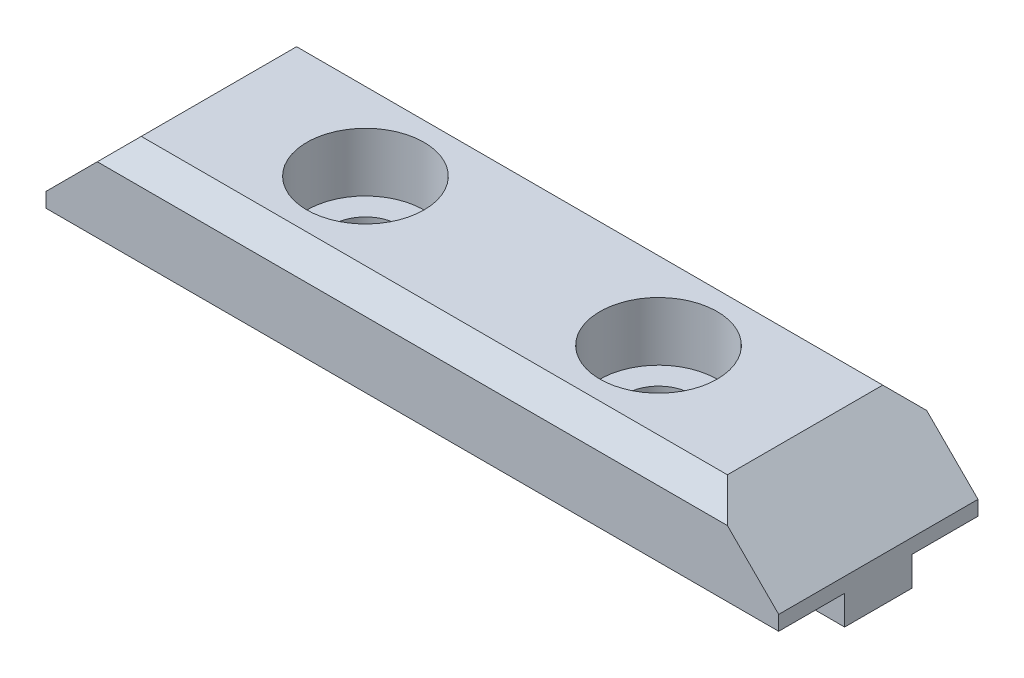
ISO-10303-21;
HEADER;
FILE_DESCRIPTION(('STEP AP214'),'2;1');
FILE_NAME('part.step','',(''),(''),'','','');
FILE_SCHEMA(('AUTOMOTIVE_DESIGN { 1 0 10303 214 1 1 1 1 }'));
ENDSEC;
DATA;
#1=APPLICATION_CONTEXT('core data for automotive mechanical design processes');
#2=APPLICATION_PROTOCOL_DEFINITION('international standard','automotive_design',2000,#1);
#3=PRODUCT_CONTEXT('',#1,'mechanical');
#4=PRODUCT('Part','Part','',(#3));
#5=PRODUCT_RELATED_PRODUCT_CATEGORY('part','',(#4));
#6=PRODUCT_DEFINITION_FORMATION('','',#4);
#7=PRODUCT_DEFINITION_CONTEXT('part definition',#1,'design');
#8=PRODUCT_DEFINITION('design','',#6,#7);
#9=PRODUCT_DEFINITION_SHAPE('','',#8);
#10=(LENGTH_UNIT() NAMED_UNIT(*) SI_UNIT(.MILLI.,.METRE.));
#11=(NAMED_UNIT(*) PLANE_ANGLE_UNIT() SI_UNIT($,.RADIAN.));
#12=(NAMED_UNIT(*) SI_UNIT($,.STERADIAN.) SOLID_ANGLE_UNIT());
#13=UNCERTAINTY_MEASURE_WITH_UNIT(LENGTH_MEASURE(1.E-05),#10,'distance_accuracy_value','');
#14=(GEOMETRIC_REPRESENTATION_CONTEXT(3) GLOBAL_UNCERTAINTY_ASSIGNED_CONTEXT((#13)) GLOBAL_UNIT_ASSIGNED_CONTEXT((#10,
#11,#12)) REPRESENTATION_CONTEXT('',''));
#15=CARTESIAN_POINT('',(0.,0.,0.));
#16=DIRECTION('',(0.,0.,1.));
#17=DIRECTION('',(1.,0.,0.));
#18=AXIS2_PLACEMENT_3D('',#15,#16,#17);
#19=CARTESIAN_POINT('',(26.5,8.,6.8));
#20=DIRECTION('',(-1.,0.,0.));
#21=DIRECTION('',(0.,0.,1.));
#22=AXIS2_PLACEMENT_3D('',#19,#20,#21);
#23=PLANE('',#22);
#24=DIRECTION('',(0.,0.,1.));
#25=VECTOR('',#24,1.);
#26=CARTESIAN_POINT('',(26.5,7.,10.2));
#27=LINE('',#26,#25);
#28=CARTESIAN_POINT('',(26.5,7.,0.));
#29=VERTEX_POINT('',#28);
#30=CARTESIAN_POINT('',(26.5,7.,13.6));
#31=VERTEX_POINT('',#30);
#32=EDGE_CURVE('E170',#29,#31,#27,.T.);
#33=ORIENTED_EDGE('',*,*,#32,.F.);
#34=DIRECTION('',(0.,-1.,0.));
#35=VECTOR('',#34,1.);
#36=CARTESIAN_POINT('',(26.5,12.,0.));
#37=LINE('',#36,#35);
#38=CARTESIAN_POINT('',(26.5,6.,0.));
#39=VERTEX_POINT('',#38);
#40=EDGE_CURVE('E158',#29,#39,#37,.T.);
#41=ORIENTED_EDGE('',*,*,#40,.T.);
#42=DIRECTION('',(0.,0.,1.));
#43=VECTOR('',#42,1.);
#44=CARTESIAN_POINT('',(26.5,6.,0.));
#45=LINE('',#44,#43);
#46=CARTESIAN_POINT('',(26.5,6.,4.5));
#47=VERTEX_POINT('',#46);
#48=EDGE_CURVE('E105',#39,#47,#45,.T.);
#49=ORIENTED_EDGE('',*,*,#48,.T.);
#50=DIRECTION('',(0.,-1.,0.));
#51=VECTOR('',#50,1.);
#52=CARTESIAN_POINT('',(26.5,6.,4.5));
#53=LINE('',#52,#51);
#54=CARTESIAN_POINT('',(26.5,4.,4.5));
#55=VERTEX_POINT('',#54);
#56=EDGE_CURVE('E11',#47,#55,#53,.T.);
#57=ORIENTED_EDGE('',*,*,#56,.T.);
#58=DIRECTION('',(0.,0.,1.));
#59=VECTOR('',#58,1.);
#60=CARTESIAN_POINT('',(26.5,4.,4.5));
#61=LINE('',#60,#59);
#62=CARTESIAN_POINT('',(26.5,4.,9.1));
#63=VERTEX_POINT('',#62);
#64=EDGE_CURVE('E57',#55,#63,#61,.T.);
#65=ORIENTED_EDGE('',*,*,#64,.T.);
#66=DIRECTION('',(0.,1.,0.));
#67=VECTOR('',#66,1.);
#68=CARTESIAN_POINT('',(26.5,4.,9.1));
#69=LINE('',#68,#67);
#70=CARTESIAN_POINT('',(26.5,6.,9.1));
#71=VERTEX_POINT('',#70);
#72=EDGE_CURVE('E62',#63,#71,#69,.T.);
#73=ORIENTED_EDGE('',*,*,#72,.T.);
#74=DIRECTION('',(0.,0.,1.));
#75=VECTOR('',#74,1.);
#76=CARTESIAN_POINT('',(26.5,6.,9.1));
#77=LINE('',#76,#75);
#78=CARTESIAN_POINT('',(26.5,6.,13.6));
#79=VERTEX_POINT('',#78);
#80=EDGE_CURVE('E110',#71,#79,#77,.T.);
#81=ORIENTED_EDGE('',*,*,#80,.T.);
#82=DIRECTION('',(0.,1.,0.));
#83=VECTOR('',#82,1.);
#84=CARTESIAN_POINT('',(26.5,6.,13.6));
#85=LINE('',#84,#83);
#86=EDGE_CURVE('E129',#79,#31,#85,.T.);
#87=ORIENTED_EDGE('',*,*,#86,.T.);
#88=EDGE_LOOP('',(#33,#41,#49,#57,#65,#73,#81,#87));
#89=FACE_BOUND('',#88,.T.);
#90=ADVANCED_FACE('F16',(#89),#23,.T.);
#91=CARTESIAN_POINT('',(76.5,8.,6.8));
#92=DIRECTION('',(1.,0.,0.));
#93=DIRECTION('',(0.,-1.,0.));
#94=AXIS2_PLACEMENT_3D('',#91,#92,#93);
#95=PLANE('',#94);
#96=DIRECTION('',(0.,0.,-1.));
#97=VECTOR('',#96,1.);
#98=CARTESIAN_POINT('',(76.5,7.,10.2));
#99=LINE('',#98,#97);
#100=CARTESIAN_POINT('',(76.5,7.,13.6));
#101=VERTEX_POINT('',#100);
#102=CARTESIAN_POINT('',(76.5,7.,0.));
#103=VERTEX_POINT('',#102);
#104=EDGE_CURVE('E153',#101,#103,#99,.T.);
#105=ORIENTED_EDGE('',*,*,#104,.F.);
#106=DIRECTION('',(0.,1.,0.));
#107=VECTOR('',#106,1.);
#108=CARTESIAN_POINT('',(76.5,6.,13.6));
#109=LINE('',#108,#107);
#110=CARTESIAN_POINT('',(76.5,6.,13.6));
#111=VERTEX_POINT('',#110);
#112=EDGE_CURVE('E196',#111,#101,#109,.T.);
#113=ORIENTED_EDGE('',*,*,#112,.F.);
#114=DIRECTION('',(0.,0.,1.));
#115=VECTOR('',#114,1.);
#116=CARTESIAN_POINT('',(76.5,6.,9.1));
#117=LINE('',#116,#115);
#118=CARTESIAN_POINT('',(76.5,6.,9.1));
#119=VERTEX_POINT('',#118);
#120=EDGE_CURVE('E107',#119,#111,#117,.T.);
#121=ORIENTED_EDGE('',*,*,#120,.F.);
#122=DIRECTION('',(0.,1.,0.));
#123=VECTOR('',#122,1.);
#124=CARTESIAN_POINT('',(76.5,4.,9.1));
#125=LINE('',#124,#123);
#126=CARTESIAN_POINT('',(76.5,4.,9.1));
#127=VERTEX_POINT('',#126);
#128=EDGE_CURVE('E83',#127,#119,#125,.T.);
#129=ORIENTED_EDGE('',*,*,#128,.F.);
#130=DIRECTION('',(0.,0.,1.));
#131=VECTOR('',#130,1.);
#132=CARTESIAN_POINT('',(76.5,4.,4.5));
#133=LINE('',#132,#131);
#134=CARTESIAN_POINT('',(76.5,4.,4.5));
#135=VERTEX_POINT('',#134);
#136=EDGE_CURVE('E68',#135,#127,#133,.T.);
#137=ORIENTED_EDGE('',*,*,#136,.F.);
#138=DIRECTION('',(0.,-1.,0.));
#139=VECTOR('',#138,1.);
#140=CARTESIAN_POINT('',(76.5,6.,4.5));
#141=LINE('',#140,#139);
#142=CARTESIAN_POINT('',(76.5,6.,4.5));
#143=VERTEX_POINT('',#142);
#144=EDGE_CURVE('E25',#143,#135,#141,.T.);
#145=ORIENTED_EDGE('',*,*,#144,.F.);
#146=DIRECTION('',(0.,0.,1.));
#147=VECTOR('',#146,1.);
#148=CARTESIAN_POINT('',(76.5,6.,0.));
#149=LINE('',#148,#147);
#150=CARTESIAN_POINT('',(76.5,6.,0.));
#151=VERTEX_POINT('',#150);
#152=EDGE_CURVE('E190',#151,#143,#149,.T.);
#153=ORIENTED_EDGE('',*,*,#152,.F.);
#154=DIRECTION('',(0.,-1.,0.));
#155=VECTOR('',#154,1.);
#156=CARTESIAN_POINT('',(76.5,12.,0.));
#157=LINE('',#156,#155);
#158=EDGE_CURVE('E159',#103,#151,#157,.T.);
#159=ORIENTED_EDGE('',*,*,#158,.F.);
#160=EDGE_LOOP('',(#105,#113,#121,#129,#137,#145,#153,#159));
#161=FACE_BOUND('',#160,.T.);
#162=ADVANCED_FACE('F261',(#161),#95,.T.);
#163=CARTESIAN_POINT('',(76.5,6.,4.5));
#164=DIRECTION('',(0.,0.,-1.));
#165=DIRECTION('',(0.,-1.,0.));
#166=AXIS2_PLACEMENT_3D('',#163,#164,#165);
#167=PLANE('',#166);
#168=ORIENTED_EDGE('',*,*,#144,.T.);
#169=DIRECTION('',(-1.,0.,0.));
#170=VECTOR('',#169,1.);
#171=CARTESIAN_POINT('',(76.5,4.,4.5));
#172=LINE('',#171,#170);
#173=EDGE_CURVE('E67',#135,#55,#172,.T.);
#174=ORIENTED_EDGE('',*,*,#173,.T.);
#175=ORIENTED_EDGE('',*,*,#56,.F.);
#176=DIRECTION('',(-1.,0.,0.));
#177=VECTOR('',#176,1.);
#178=CARTESIAN_POINT('',(76.5,6.,4.5));
#179=LINE('',#178,#177);
#180=EDGE_CURVE('E186',#143,#47,#179,.T.);
#181=ORIENTED_EDGE('',*,*,#180,.F.);
#182=EDGE_LOOP('',(#168,#174,#175,#181));
#183=FACE_BOUND('',#182,.T.);
#184=ADVANCED_FACE('F325',(#183),#167,.T.);
#185=CARTESIAN_POINT('',(76.5,4.,4.5));
#186=DIRECTION('',(0.,-1.,0.));
#187=DIRECTION('',(-1.,0.,0.));
#188=AXIS2_PLACEMENT_3D('',#185,#186,#187);
#189=PLANE('',#188);
#190=CARTESIAN_POINT('',(41.5,4.,6.8));
#191=DIRECTION('',(0.,1.,0.));
#192=DIRECTION('',(-1.,0.,0.));
#193=AXIS2_PLACEMENT_3D('',#190,#191,#192);
#194=CIRCLE('',#193,2.25);
#195=CARTESIAN_POINT('',(43.75,4.,6.8));
#196=VERTEX_POINT('',#195);
#197=EDGE_CURVE('E147',#196,#196,#194,.T.);
#198=ORIENTED_EDGE('',*,*,#197,.T.);
#199=EDGE_LOOP('',(#198));
#200=FACE_BOUND('',#199,.T.);
#201=CARTESIAN_POINT('',(61.5,4.,6.8));
#202=DIRECTION('',(0.,1.,0.));
#203=DIRECTION('',(-1.,0.,0.));
#204=AXIS2_PLACEMENT_3D('',#201,#202,#203);
#205=CIRCLE('',#204,2.25);
#206=CARTESIAN_POINT('',(63.75,4.,6.8));
#207=VERTEX_POINT('',#206);
#208=EDGE_CURVE('E220',#207,#207,#205,.T.);
#209=ORIENTED_EDGE('',*,*,#208,.T.);
#210=EDGE_LOOP('',(#209));
#211=FACE_BOUND('',#210,.T.);
#212=ORIENTED_EDGE('',*,*,#136,.T.);
#213=DIRECTION('',(-1.,0.,0.));
#214=VECTOR('',#213,1.);
#215=CARTESIAN_POINT('',(76.5,4.,9.1));
#216=LINE('',#215,#214);
#217=EDGE_CURVE('E71',#127,#63,#216,.T.);
#218=ORIENTED_EDGE('',*,*,#217,.T.);
#219=ORIENTED_EDGE('',*,*,#64,.F.);
#220=ORIENTED_EDGE('',*,*,#173,.F.);
#221=EDGE_LOOP('',(#212,#218,#219,#220));
#222=FACE_BOUND('',#221,.T.);
#223=ADVANCED_FACE('F72',(#200,#211,#222),#189,.T.);
#224=CARTESIAN_POINT('',(76.5,4.,9.1));
#225=DIRECTION('',(0.,0.,1.));
#226=DIRECTION('',(1.,0.,0.));
#227=AXIS2_PLACEMENT_3D('',#224,#225,#226);
#228=PLANE('',#227);
#229=ORIENTED_EDGE('',*,*,#128,.T.);
#230=DIRECTION('',(-1.,0.,0.));
#231=VECTOR('',#230,1.);
#232=CARTESIAN_POINT('',(76.5,6.,9.1));
#233=LINE('',#232,#231);
#234=EDGE_CURVE('E80',#119,#71,#233,.T.);
#235=ORIENTED_EDGE('',*,*,#234,.T.);
#236=ORIENTED_EDGE('',*,*,#72,.F.);
#237=ORIENTED_EDGE('',*,*,#217,.F.);
#238=EDGE_LOOP('',(#229,#235,#236,#237));
#239=FACE_BOUND('',#238,.T.);
#240=ADVANCED_FACE('F78',(#239),#228,.T.);
#241=CARTESIAN_POINT('',(76.5,6.,9.1));
#242=DIRECTION('',(0.,-1.,0.));
#243=DIRECTION('',(-1.,0.,0.));
#244=AXIS2_PLACEMENT_3D('',#241,#242,#243);
#245=PLANE('',#244);
#246=ORIENTED_EDGE('',*,*,#120,.T.);
#247=DIRECTION('',(-1.,0.,0.));
#248=VECTOR('',#247,1.);
#249=CARTESIAN_POINT('',(76.5,6.,13.6));
#250=LINE('',#249,#248);
#251=EDGE_CURVE('E138',#111,#79,#250,.T.);
#252=ORIENTED_EDGE('',*,*,#251,.T.);
#253=ORIENTED_EDGE('',*,*,#80,.F.);
#254=ORIENTED_EDGE('',*,*,#234,.F.);
#255=EDGE_LOOP('',(#246,#252,#253,#254));
#256=FACE_BOUND('',#255,.T.);
#257=ADVANCED_FACE('F316',(#256),#245,.T.);
#258=CARTESIAN_POINT('',(76.5,6.,0.));
#259=DIRECTION('',(0.,-1.,0.));
#260=DIRECTION('',(-1.,0.,0.));
#261=AXIS2_PLACEMENT_3D('',#258,#259,#260);
#262=PLANE('',#261);
#263=ORIENTED_EDGE('',*,*,#152,.T.);
#264=ORIENTED_EDGE('',*,*,#180,.T.);
#265=ORIENTED_EDGE('',*,*,#48,.F.);
#266=DIRECTION('',(-1.,0.,0.));
#267=VECTOR('',#266,1.);
#268=CARTESIAN_POINT('',(76.5,6.,0.));
#269=LINE('',#268,#267);
#270=EDGE_CURVE('E163',#151,#39,#269,.T.);
#271=ORIENTED_EDGE('',*,*,#270,.F.);
#272=EDGE_LOOP('',(#263,#264,#265,#271));
#273=FACE_BOUND('',#272,.T.);
#274=ADVANCED_FACE('F253',(#273),#262,.T.);
#275=CARTESIAN_POINT('',(41.5,8.,6.8));
#276=DIRECTION('',(0.,1.,0.));
#277=DIRECTION('',(1.,0.,0.));
#278=AXIS2_PLACEMENT_3D('',#275,#276,#277);
#279=PLANE('',#278);
#280=CARTESIAN_POINT('',(41.5,8.,6.8));
#281=DIRECTION('',(0.,-1.,0.));
#282=DIRECTION('',(-1.,0.,0.));
#283=AXIS2_PLACEMENT_3D('',#280,#281,#282);
#284=CIRCLE('',#283,2.25);
#285=CARTESIAN_POINT('',(43.75,8.,6.8));
#286=VERTEX_POINT('',#285);
#287=EDGE_CURVE('E148',#286,#286,#284,.T.);
#288=ORIENTED_EDGE('',*,*,#287,.T.);
#289=EDGE_LOOP('',(#288));
#290=FACE_BOUND('',#289,.T.);
#291=CARTESIAN_POINT('',(41.5,8.,6.8));
#292=DIRECTION('',(0.,-1.,0.));
#293=DIRECTION('',(-1.,0.,0.));
#294=AXIS2_PLACEMENT_3D('',#291,#292,#293);
#295=CIRCLE('',#294,4.);
#296=CARTESIAN_POINT('',(45.5,8.,6.8));
#297=VERTEX_POINT('',#296);
#298=EDGE_CURVE('E242',#297,#297,#295,.T.);
#299=ORIENTED_EDGE('',*,*,#298,.F.);
#300=EDGE_LOOP('',(#299));
#301=FACE_BOUND('',#300,.T.);
#302=ADVANCED_FACE('F304',(#290,#301),#279,.T.);
#303=CARTESIAN_POINT('',(41.5,12.,6.8));
#304=DIRECTION('',(0.,-1.,0.));
#305=DIRECTION('',(-1.,0.,0.));
#306=AXIS2_PLACEMENT_3D('',#303,#304,#305);
#307=CYLINDRICAL_SURFACE('',#306,4.);
#308=CARTESIAN_POINT('',(41.5,12.,6.8));
#309=DIRECTION('',(0.,-1.,0.));
#310=DIRECTION('',(-1.,0.,0.));
#311=AXIS2_PLACEMENT_3D('',#308,#309,#310);
#312=CIRCLE('',#311,4.);
#313=CARTESIAN_POINT('',(45.5,12.,6.8));
#314=VERTEX_POINT('',#313);
#315=EDGE_CURVE('E176',#314,#314,#312,.T.);
#316=ORIENTED_EDGE('',*,*,#315,.F.);
#317=DIRECTION('',(0.,-1.,0.));
#318=VECTOR('',#317,1.);
#319=CARTESIAN_POINT('',(45.5,12.,6.8));
#320=LINE('',#319,#318);
#321=EDGE_CURVE('E235',#314,#297,#320,.T.);
#322=ORIENTED_EDGE('',*,*,#321,.T.);
#323=ORIENTED_EDGE('',*,*,#298,.T.);
#324=ORIENTED_EDGE('',*,*,#321,.F.);
#325=EDGE_LOOP('',(#316,#322,#323,#324));
#326=FACE_BOUND('',#325,.T.);
#327=ADVANCED_FACE('F300',(#326),#307,.F.);
#328=CARTESIAN_POINT('',(61.5,8.,6.8));
#329=DIRECTION('',(0.,1.,0.));
#330=DIRECTION('',(1.,0.,0.));
#331=AXIS2_PLACEMENT_3D('',#328,#329,#330);
#332=PLANE('',#331);
#333=CARTESIAN_POINT('',(61.5,8.,6.8));
#334=DIRECTION('',(0.,-1.,0.));
#335=DIRECTION('',(-1.,0.,0.));
#336=AXIS2_PLACEMENT_3D('',#333,#334,#335);
#337=CIRCLE('',#336,2.25);
#338=CARTESIAN_POINT('',(63.75,8.,6.8));
#339=VERTEX_POINT('',#338);
#340=EDGE_CURVE('E157',#339,#339,#337,.T.);
#341=ORIENTED_EDGE('',*,*,#340,.T.);
#342=EDGE_LOOP('',(#341));
#343=FACE_BOUND('',#342,.T.);
#344=CARTESIAN_POINT('',(61.5,8.,6.8));
#345=DIRECTION('',(0.,-1.,0.));
#346=DIRECTION('',(-1.,0.,0.));
#347=AXIS2_PLACEMENT_3D('',#344,#345,#346);
#348=CIRCLE('',#347,4.);
#349=CARTESIAN_POINT('',(65.5,8.,6.8));
#350=VERTEX_POINT('',#349);
#351=EDGE_CURVE('E231',#350,#350,#348,.T.);
#352=ORIENTED_EDGE('',*,*,#351,.F.);
#353=EDGE_LOOP('',(#352));
#354=FACE_BOUND('',#353,.T.);
#355=ADVANCED_FACE('F314',(#343,#354),#332,.T.);
#356=CARTESIAN_POINT('',(61.5,12.,6.8));
#357=DIRECTION('',(0.,-1.,0.));
#358=DIRECTION('',(-1.,0.,0.));
#359=AXIS2_PLACEMENT_3D('',#356,#357,#358);
#360=CYLINDRICAL_SURFACE('',#359,4.);
#361=CARTESIAN_POINT('',(61.5,12.,6.8));
#362=DIRECTION('',(0.,-1.,0.));
#363=DIRECTION('',(-1.,0.,0.));
#364=AXIS2_PLACEMENT_3D('',#361,#362,#363);
#365=CIRCLE('',#364,4.);
#366=CARTESIAN_POINT('',(65.5,12.,6.8));
#367=VERTEX_POINT('',#366);
#368=EDGE_CURVE('E171',#367,#367,#365,.T.);
#369=ORIENTED_EDGE('',*,*,#368,.F.);
#370=DIRECTION('',(0.,-1.,0.));
#371=VECTOR('',#370,1.);
#372=CARTESIAN_POINT('',(65.5,12.,6.8));
#373=LINE('',#372,#371);
#374=EDGE_CURVE('E230',#367,#350,#373,.T.);
#375=ORIENTED_EDGE('',*,*,#374,.T.);
#376=ORIENTED_EDGE('',*,*,#351,.T.);
#377=ORIENTED_EDGE('',*,*,#374,.F.);
#378=EDGE_LOOP('',(#369,#375,#376,#377));
#379=FACE_BOUND('',#378,.T.);
#380=ADVANCED_FACE('F335',(#379),#360,.F.);
#381=CARTESIAN_POINT('',(41.5,8.,6.8));
#382=DIRECTION('',(0.,-1.,0.));
#383=DIRECTION('',(-1.,0.,0.));
#384=AXIS2_PLACEMENT_3D('',#381,#382,#383);
#385=CYLINDRICAL_SURFACE('',#384,2.25);
#386=ORIENTED_EDGE('',*,*,#287,.F.);
#387=DIRECTION('',(0.,-1.,0.));
#388=VECTOR('',#387,1.);
#389=CARTESIAN_POINT('',(43.75,8.,6.8));
#390=LINE('',#389,#388);
#391=EDGE_CURVE('E143',#286,#196,#390,.T.);
#392=ORIENTED_EDGE('',*,*,#391,.T.);
#393=ORIENTED_EDGE('',*,*,#197,.F.);
#394=ORIENTED_EDGE('',*,*,#391,.F.);
#395=EDGE_LOOP('',(#386,#392,#393,#394));
#396=FACE_BOUND('',#395,.T.);
#397=ADVANCED_FACE('F337',(#396),#385,.F.);
#398=CARTESIAN_POINT('',(61.5,8.,6.8));
#399=DIRECTION('',(0.,-1.,0.));
#400=DIRECTION('',(-1.,0.,0.));
#401=AXIS2_PLACEMENT_3D('',#398,#399,#400);
#402=CYLINDRICAL_SURFACE('',#401,2.25);
#403=ORIENTED_EDGE('',*,*,#340,.F.);
#404=DIRECTION('',(0.,-1.,0.));
#405=VECTOR('',#404,1.);
#406=CARTESIAN_POINT('',(63.75,8.,6.8));
#407=LINE('',#406,#405);
#408=EDGE_CURVE('E216',#339,#207,#407,.T.);
#409=ORIENTED_EDGE('',*,*,#408,.T.);
#410=ORIENTED_EDGE('',*,*,#208,.F.);
#411=ORIENTED_EDGE('',*,*,#408,.F.);
#412=EDGE_LOOP('',(#403,#409,#410,#411));
#413=FACE_BOUND('',#412,.T.);
#414=ADVANCED_FACE('F342',(#413),#402,.F.);
#415=CARTESIAN_POINT('',(74.,9.5,10.2));
#416=DIRECTION('',(0.707106781186548,0.707106781186547,0.));
#417=DIRECTION('',(0.,0.,-1.));
#418=AXIS2_PLACEMENT_3D('',#415,#416,#417);
#419=PLANE('',#418);
#420=DIRECTION('',(0.577350269189626,-0.577350269189626,-0.577350269189626));
#421=VECTOR('',#420,1.);
#422=CARTESIAN_POINT('',(71.9666666666667,11.5333333333333,1.03333333333333));
#423=LINE('',#422,#421);
#424=CARTESIAN_POINT('',(71.5,12.,1.5));
#425=VERTEX_POINT('',#424);
#426=CARTESIAN_POINT('',(73.,10.5,0.));
#427=VERTEX_POINT('',#426);
#428=EDGE_CURVE('E123',#425,#427,#423,.T.);
#429=ORIENTED_EDGE('',*,*,#428,.F.);
#430=DIRECTION('',(0.,0.,1.));
#431=VECTOR('',#430,1.);
#432=CARTESIAN_POINT('',(71.5,12.,10.2));
#433=LINE('',#432,#431);
#434=CARTESIAN_POINT('',(71.5,12.,12.1));
#435=VERTEX_POINT('',#434);
#436=EDGE_CURVE('E152',#425,#435,#433,.T.);
#437=ORIENTED_EDGE('',*,*,#436,.T.);
#438=DIRECTION('',(-0.577350269189626,0.577350269189626,-0.577350269189626));
#439=VECTOR('',#438,1.);
#440=CARTESIAN_POINT('',(73.1,10.4,13.7));
#441=LINE('',#440,#439);
#442=CARTESIAN_POINT('',(73.,10.5,13.6));
#443=VERTEX_POINT('',#442);
#444=EDGE_CURVE('E125',#443,#435,#441,.T.);
#445=ORIENTED_EDGE('',*,*,#444,.F.);
#446=DIRECTION('',(0.707106781186547,-0.707106781186548,0.));
#447=VECTOR('',#446,1.);
#448=CARTESIAN_POINT('',(75.5,8.,13.6));
#449=LINE('',#448,#447);
#450=EDGE_CURVE('E200',#443,#101,#449,.T.);
#451=ORIENTED_EDGE('',*,*,#450,.T.);
#452=ORIENTED_EDGE('',*,*,#104,.T.);
#453=DIRECTION('',(-0.707106781186547,0.707106781186548,0.));
#454=VECTOR('',#453,1.);
#455=CARTESIAN_POINT('',(74.,9.5,0.));
#456=LINE('',#455,#454);
#457=EDGE_CURVE('E164',#103,#427,#456,.T.);
#458=ORIENTED_EDGE('',*,*,#457,.T.);
#459=EDGE_LOOP('',(#429,#437,#445,#451,#452,#458));
#460=FACE_BOUND('',#459,.T.);
#461=ADVANCED_FACE('F349',(#460),#419,.T.);
#462=CARTESIAN_POINT('',(76.5,12.,0.));
#463=DIRECTION('',(0.,0.,-1.));
#464=DIRECTION('',(0.,-1.,0.));
#465=AXIS2_PLACEMENT_3D('',#462,#463,#464);
#466=PLANE('',#465);
#467=DIRECTION('',(-1.,0.,0.));
#468=VECTOR('',#467,1.);
#469=CARTESIAN_POINT('',(76.5,10.5,0.));
#470=LINE('',#469,#468);
#471=CARTESIAN_POINT('',(30.,10.5,0.));
#472=VERTEX_POINT('',#471);
#473=EDGE_CURVE('E131',#427,#472,#470,.T.);
#474=ORIENTED_EDGE('',*,*,#473,.F.);
#475=ORIENTED_EDGE('',*,*,#457,.F.);
#476=ORIENTED_EDGE('',*,*,#158,.T.);
#477=ORIENTED_EDGE('',*,*,#270,.T.);
#478=ORIENTED_EDGE('',*,*,#40,.F.);
#479=DIRECTION('',(-0.707106781186548,-0.707106781186547,0.));
#480=VECTOR('',#479,1.);
#481=CARTESIAN_POINT('',(41.5,22.,0.));
#482=LINE('',#481,#480);
#483=EDGE_CURVE('E175',#472,#29,#482,.T.);
#484=ORIENTED_EDGE('',*,*,#483,.F.);
#485=EDGE_LOOP('',(#474,#475,#476,#477,#478,#484));
#486=FACE_BOUND('',#485,.T.);
#487=ADVANCED_FACE('F351',(#486),#466,.T.);
#488=CARTESIAN_POINT('',(76.5,6.,13.6));
#489=DIRECTION('',(0.,0.,1.));
#490=DIRECTION('',(1.,0.,0.));
#491=AXIS2_PLACEMENT_3D('',#488,#489,#490);
#492=PLANE('',#491);
#493=DIRECTION('',(1.,0.,0.));
#494=VECTOR('',#493,1.);
#495=CARTESIAN_POINT('',(76.5,10.5,13.6));
#496=LINE('',#495,#494);
#497=CARTESIAN_POINT('',(30.,10.5,13.6));
#498=VERTEX_POINT('',#497);
#499=EDGE_CURVE('E130',#498,#443,#496,.T.);
#500=ORIENTED_EDGE('',*,*,#499,.F.);
#501=DIRECTION('',(0.707106781186548,0.707106781186547,0.));
#502=VECTOR('',#501,1.);
#503=CARTESIAN_POINT('',(40.,20.5,13.6));
#504=LINE('',#503,#502);
#505=EDGE_CURVE('E165',#31,#498,#504,.T.);
#506=ORIENTED_EDGE('',*,*,#505,.F.);
#507=ORIENTED_EDGE('',*,*,#86,.F.);
#508=ORIENTED_EDGE('',*,*,#251,.F.);
#509=ORIENTED_EDGE('',*,*,#112,.T.);
#510=ORIENTED_EDGE('',*,*,#450,.F.);
#511=EDGE_LOOP('',(#500,#506,#507,#508,#509,#510));
#512=FACE_BOUND('',#511,.T.);
#513=ADVANCED_FACE('F354',(#512),#492,.T.);
#514=CARTESIAN_POINT('',(76.5,11.25,12.85));
#515=DIRECTION('',(0.,0.707106781186548,0.707106781186547));
#516=DIRECTION('',(1.,0.,0.));
#517=AXIS2_PLACEMENT_3D('',#514,#515,#516);
#518=PLANE('',#517);
#519=DIRECTION('',(-0.577350269189626,-0.577350269189626,0.577350269189626));
#520=VECTOR('',#519,1.);
#521=CARTESIAN_POINT('',(38.2333333333333,18.7333333333333,5.36666666666667));
#522=LINE('',#521,#520);
#523=CARTESIAN_POINT('',(31.5,12.,12.1));
#524=VERTEX_POINT('',#523);
#525=EDGE_CURVE('E169',#524,#498,#522,.T.);
#526=ORIENTED_EDGE('',*,*,#525,.T.);
#527=ORIENTED_EDGE('',*,*,#499,.T.);
#528=ORIENTED_EDGE('',*,*,#444,.T.);
#529=DIRECTION('',(-1.,0.,0.));
#530=VECTOR('',#529,1.);
#531=CARTESIAN_POINT('',(76.5,12.,12.1));
#532=LINE('',#531,#530);
#533=EDGE_CURVE('E142',#435,#524,#532,.T.);
#534=ORIENTED_EDGE('',*,*,#533,.T.);
#535=EDGE_LOOP('',(#526,#527,#528,#534));
#536=FACE_BOUND('',#535,.T.);
#537=ADVANCED_FACE('F360',(#536),#518,.T.);
#538=CARTESIAN_POINT('',(29.,9.5,10.2));
#539=DIRECTION('',(-0.707106781186547,0.707106781186548,0.));
#540=DIRECTION('',(0.,0.,1.));
#541=AXIS2_PLACEMENT_3D('',#538,#539,#540);
#542=PLANE('',#541);
#543=DIRECTION('',(0.577350269189626,0.577350269189626,0.577350269189626));
#544=VECTOR('',#543,1.);
#545=CARTESIAN_POINT('',(39.3666666666667,19.8666666666667,9.36666666666667));
#546=LINE('',#545,#544);
#547=CARTESIAN_POINT('',(31.5,12.,1.5));
#548=VERTEX_POINT('',#547);
#549=EDGE_CURVE('E386',#472,#548,#546,.T.);
#550=ORIENTED_EDGE('',*,*,#549,.F.);
#551=ORIENTED_EDGE('',*,*,#483,.T.);
#552=ORIENTED_EDGE('',*,*,#32,.T.);
#553=ORIENTED_EDGE('',*,*,#505,.T.);
#554=ORIENTED_EDGE('',*,*,#525,.F.);
#555=DIRECTION('',(0.,0.,-1.));
#556=VECTOR('',#555,1.);
#557=CARTESIAN_POINT('',(31.5,12.,10.2));
#558=LINE('',#557,#556);
#559=EDGE_CURVE('E135',#524,#548,#558,.T.);
#560=ORIENTED_EDGE('',*,*,#559,.T.);
#561=EDGE_LOOP('',(#550,#551,#552,#553,#554,#560));
#562=FACE_BOUND('',#561,.T.);
#563=ADVANCED_FACE('F454',(#562),#542,.T.);
#564=CARTESIAN_POINT('',(76.5,12.,13.6));
#565=DIRECTION('',(0.,1.,0.));
#566=DIRECTION('',(1.,0.,0.));
#567=AXIS2_PLACEMENT_3D('',#564,#565,#566);
#568=PLANE('',#567);
#569=ORIENTED_EDGE('',*,*,#368,.T.);
#570=EDGE_LOOP('',(#569));
#571=FACE_BOUND('',#570,.T.);
#572=ORIENTED_EDGE('',*,*,#315,.T.);
#573=EDGE_LOOP('',(#572));
#574=FACE_BOUND('',#573,.T.);
#575=DIRECTION('',(1.,0.,0.));
#576=VECTOR('',#575,1.);
#577=CARTESIAN_POINT('',(76.5,12.,1.5));
#578=LINE('',#577,#576);
#579=EDGE_CURVE('E380',#548,#425,#578,.T.);
#580=ORIENTED_EDGE('',*,*,#579,.F.);
#581=ORIENTED_EDGE('',*,*,#559,.F.);
#582=ORIENTED_EDGE('',*,*,#533,.F.);
#583=ORIENTED_EDGE('',*,*,#436,.F.);
#584=EDGE_LOOP('',(#580,#581,#582,#583));
#585=FACE_BOUND('',#584,.T.);
#586=ADVANCED_FACE('F404',(#571,#574,#585),#568,.T.);
#587=CARTESIAN_POINT('',(76.5,11.25,0.75));
#588=DIRECTION('',(0.,0.707106781186548,-0.707106781186548));
#589=DIRECTION('',(-1.,0.,0.));
#590=AXIS2_PLACEMENT_3D('',#587,#588,#589);
#591=PLANE('',#590);
#592=ORIENTED_EDGE('',*,*,#549,.T.);
#593=ORIENTED_EDGE('',*,*,#579,.T.);
#594=ORIENTED_EDGE('',*,*,#428,.T.);
#595=ORIENTED_EDGE('',*,*,#473,.T.);
#596=EDGE_LOOP('',(#592,#593,#594,#595));
#597=FACE_BOUND('',#596,.T.);
#598=ADVANCED_FACE('F378',(#597),#591,.T.);
#599=CLOSED_SHELL('',(#90,#162,#184,#223,#240,#257,#274,#302,#327,#355,#380,#397,#414,#461,#487,
#513,#537,#563,#586,#598));
#600=MANIFOLD_SOLID_BREP('B1',#599);
#601=ADVANCED_BREP_SHAPE_REPRESENTATION('',(#18,#600),#14);
#602=SHAPE_DEFINITION_REPRESENTATION(#9,#601);
ENDSEC;
END-ISO-10303-21;
